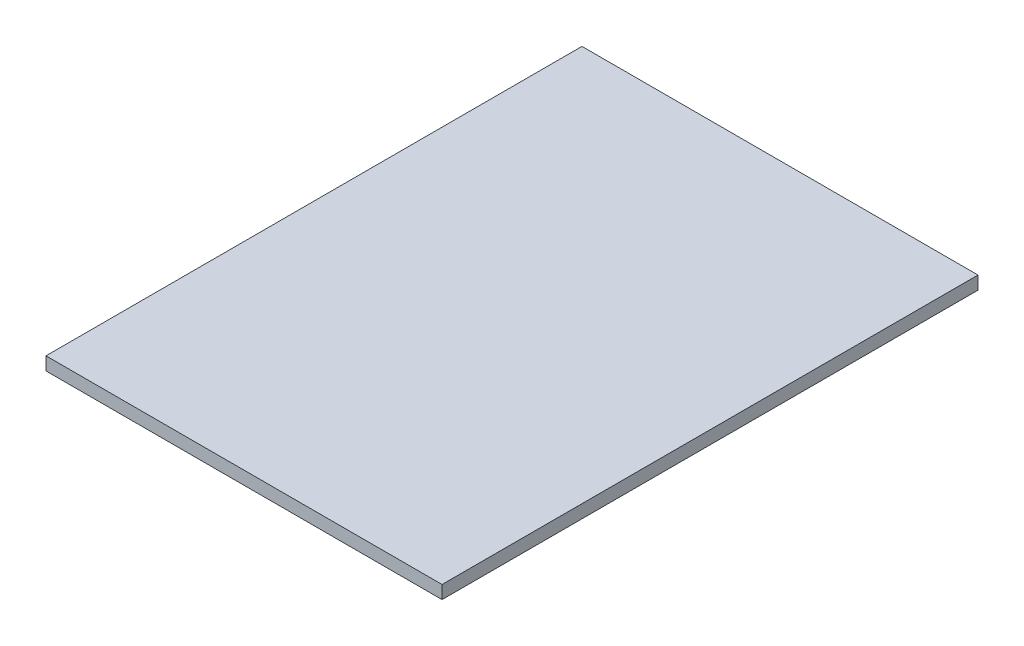
ISO-10303-21;
HEADER;
FILE_DESCRIPTION(('STEP AP214'),'2;1');
FILE_NAME('part.step','',(''),(''),'','','');
FILE_SCHEMA(('AUTOMOTIVE_DESIGN { 1 0 10303 214 1 1 1 1 }'));
ENDSEC;
DATA;
#1=APPLICATION_CONTEXT('core data for automotive mechanical design processes');
#2=APPLICATION_PROTOCOL_DEFINITION('international standard','automotive_design',2000,#1);
#3=PRODUCT_CONTEXT('',#1,'mechanical');
#4=PRODUCT('Part','Part','',(#3));
#5=PRODUCT_RELATED_PRODUCT_CATEGORY('part','',(#4));
#6=PRODUCT_DEFINITION_FORMATION('','',#4);
#7=PRODUCT_DEFINITION_CONTEXT('part definition',#1,'design');
#8=PRODUCT_DEFINITION('design','',#6,#7);
#9=PRODUCT_DEFINITION_SHAPE('','',#8);
#10=(LENGTH_UNIT() NAMED_UNIT(*) SI_UNIT(.MILLI.,.METRE.));
#11=(NAMED_UNIT(*) PLANE_ANGLE_UNIT() SI_UNIT($,.RADIAN.));
#12=(NAMED_UNIT(*) SI_UNIT($,.STERADIAN.) SOLID_ANGLE_UNIT());
#13=UNCERTAINTY_MEASURE_WITH_UNIT(LENGTH_MEASURE(1.E-05),#10,'distance_accuracy_value','');
#14=(GEOMETRIC_REPRESENTATION_CONTEXT(3) GLOBAL_UNCERTAINTY_ASSIGNED_CONTEXT((#13)) GLOBAL_UNIT_ASSIGNED_CONTEXT((#10,
#11,#12)) REPRESENTATION_CONTEXT('',''));
#15=CARTESIAN_POINT('',(0.,0.,0.));
#16=DIRECTION('',(0.,0.,1.));
#17=DIRECTION('',(1.,0.,0.));
#18=AXIS2_PLACEMENT_3D('',#15,#16,#17);
#19=CARTESIAN_POINT('',(64.1919634007864,5.,106.233178867499));
#20=DIRECTION('',(-1.,0.,0.));
#21=DIRECTION('',(0.,0.,1.));
#22=AXIS2_PLACEMENT_3D('',#19,#20,#21);
#23=PLANE('',#22);
#24=DIRECTION('',(0.,0.,-1.));
#25=VECTOR('',#24,1.);
#26=CARTESIAN_POINT('',(64.1919634007864,0.,106.233178867499));
#27=LINE('',#26,#25);
#28=CARTESIAN_POINT('',(64.1919634007864,0.,106.233178867499));
#29=VERTEX_POINT('',#28);
#30=CARTESIAN_POINT('',(64.1919634007864,0.,-98.0961694223284));
#31=VERTEX_POINT('',#30);
#32=EDGE_CURVE('E99',#29,#31,#27,.T.);
#33=ORIENTED_EDGE('',*,*,#32,.T.);
#34=DIRECTION('',(0.,-1.,0.));
#35=VECTOR('',#34,1.);
#36=CARTESIAN_POINT('',(64.1919634007864,5.,-98.0961694223284));
#37=LINE('',#36,#35);
#38=CARTESIAN_POINT('',(64.1919634007864,5.,-98.0961694223284));
#39=VERTEX_POINT('',#38);
#40=EDGE_CURVE('E11',#39,#31,#37,.T.);
#41=ORIENTED_EDGE('',*,*,#40,.F.);
#42=DIRECTION('',(0.,0.,-1.));
#43=VECTOR('',#42,1.);
#44=CARTESIAN_POINT('',(64.1919634007864,5.,106.233178867499));
#45=LINE('',#44,#43);
#46=CARTESIAN_POINT('',(64.1919634007864,5.,106.233178867499));
#47=VERTEX_POINT('',#46);
#48=EDGE_CURVE('E87',#47,#39,#45,.T.);
#49=ORIENTED_EDGE('',*,*,#48,.F.);
#50=DIRECTION('',(0.,-1.,0.));
#51=VECTOR('',#50,1.);
#52=CARTESIAN_POINT('',(64.1919634007864,5.,106.233178867499));
#53=LINE('',#52,#51);
#54=EDGE_CURVE('E95',#47,#29,#53,.T.);
#55=ORIENTED_EDGE('',*,*,#54,.T.);
#56=EDGE_LOOP('',(#33,#41,#49,#55));
#57=FACE_BOUND('',#56,.T.);
#58=ADVANCED_FACE('F36',(#57),#23,.F.);
#59=CARTESIAN_POINT('',(-86.7947674151477,5.,-98.0961694223284));
#60=DIRECTION('',(0.,0.,1.));
#61=DIRECTION('',(1.,0.,0.));
#62=AXIS2_PLACEMENT_3D('',#59,#60,#61);
#63=PLANE('',#62);
#64=DIRECTION('',(-1.,0.,0.));
#65=VECTOR('',#64,1.);
#66=CARTESIAN_POINT('',(-86.7947674151477,0.,-98.0961694223284));
#67=LINE('',#66,#65);
#68=CARTESIAN_POINT('',(-86.7947674151477,0.,-98.0961694223284));
#69=VERTEX_POINT('',#68);
#70=EDGE_CURVE('E91',#31,#69,#67,.T.);
#71=ORIENTED_EDGE('',*,*,#70,.T.);
#72=DIRECTION('',(0.,-1.,0.));
#73=VECTOR('',#72,1.);
#74=CARTESIAN_POINT('',(-86.7947674151477,5.,-98.0961694223284));
#75=LINE('',#74,#73);
#76=CARTESIAN_POINT('',(-86.7947674151477,5.,-98.0961694223284));
#77=VERTEX_POINT('',#76);
#78=EDGE_CURVE('E44',#77,#69,#75,.T.);
#79=ORIENTED_EDGE('',*,*,#78,.F.);
#80=DIRECTION('',(-1.,0.,0.));
#81=VECTOR('',#80,1.);
#82=CARTESIAN_POINT('',(-86.7947674151477,5.,-98.0961694223284));
#83=LINE('',#82,#81);
#84=EDGE_CURVE('E82',#39,#77,#83,.T.);
#85=ORIENTED_EDGE('',*,*,#84,.F.);
#86=ORIENTED_EDGE('',*,*,#40,.T.);
#87=EDGE_LOOP('',(#71,#79,#85,#86));
#88=FACE_BOUND('',#87,.T.);
#89=ADVANCED_FACE('F90',(#88),#63,.F.);
#90=CARTESIAN_POINT('',(-86.7947674151477,5.,106.233178867499));
#91=DIRECTION('',(1.,0.,0.));
#92=DIRECTION('',(0.,0.,-1.));
#93=AXIS2_PLACEMENT_3D('',#90,#91,#92);
#94=PLANE('',#93);
#95=DIRECTION('',(0.,0.,1.));
#96=VECTOR('',#95,1.);
#97=CARTESIAN_POINT('',(-86.7947674151477,0.,106.233178867499));
#98=LINE('',#97,#96);
#99=CARTESIAN_POINT('',(-86.7947674151477,0.,106.233178867499));
#100=VERTEX_POINT('',#99);
#101=EDGE_CURVE('E69',#69,#100,#98,.T.);
#102=ORIENTED_EDGE('',*,*,#101,.T.);
#103=DIRECTION('',(0.,-1.,0.));
#104=VECTOR('',#103,1.);
#105=CARTESIAN_POINT('',(-86.7947674151477,5.,106.233178867499));
#106=LINE('',#105,#104);
#107=CARTESIAN_POINT('',(-86.7947674151477,5.,106.233178867499));
#108=VERTEX_POINT('',#107);
#109=EDGE_CURVE('E92',#108,#100,#106,.T.);
#110=ORIENTED_EDGE('',*,*,#109,.F.);
#111=DIRECTION('',(0.,0.,1.));
#112=VECTOR('',#111,1.);
#113=CARTESIAN_POINT('',(-86.7947674151477,5.,106.233178867499));
#114=LINE('',#113,#112);
#115=EDGE_CURVE('E85',#77,#108,#114,.T.);
#116=ORIENTED_EDGE('',*,*,#115,.F.);
#117=ORIENTED_EDGE('',*,*,#78,.T.);
#118=EDGE_LOOP('',(#102,#110,#116,#117));
#119=FACE_BOUND('',#118,.T.);
#120=ADVANCED_FACE('F93',(#119),#94,.F.);
#121=CARTESIAN_POINT('',(-86.7947674151477,5.,106.233178867499));
#122=DIRECTION('',(0.,0.,-1.));
#123=DIRECTION('',(-1.,0.,0.));
#124=AXIS2_PLACEMENT_3D('',#121,#122,#123);
#125=PLANE('',#124);
#126=DIRECTION('',(1.,0.,0.));
#127=VECTOR('',#126,1.);
#128=CARTESIAN_POINT('',(-86.7947674151477,0.,106.233178867499));
#129=LINE('',#128,#127);
#130=EDGE_CURVE('E75',#100,#29,#129,.T.);
#131=ORIENTED_EDGE('',*,*,#130,.T.);
#132=ORIENTED_EDGE('',*,*,#54,.F.);
#133=DIRECTION('',(1.,0.,0.));
#134=VECTOR('',#133,1.);
#135=CARTESIAN_POINT('',(-86.7947674151477,5.,106.233178867499));
#136=LINE('',#135,#134);
#137=EDGE_CURVE('E52',#108,#47,#136,.T.);
#138=ORIENTED_EDGE('',*,*,#137,.F.);
#139=ORIENTED_EDGE('',*,*,#109,.T.);
#140=EDGE_LOOP('',(#131,#132,#138,#139));
#141=FACE_BOUND('',#140,.T.);
#142=ADVANCED_FACE('F106',(#141),#125,.F.);
#143=CARTESIAN_POINT('',(0.,5.,0.));
#144=DIRECTION('',(0.,-1.,0.));
#145=DIRECTION('',(0.,0.,-1.));
#146=AXIS2_PLACEMENT_3D('',#143,#144,#145);
#147=PLANE('',#146);
#148=ORIENTED_EDGE('',*,*,#48,.T.);
#149=ORIENTED_EDGE('',*,*,#84,.T.);
#150=ORIENTED_EDGE('',*,*,#115,.T.);
#151=ORIENTED_EDGE('',*,*,#137,.T.);
#152=EDGE_LOOP('',(#148,#149,#150,#151));
#153=FACE_BOUND('',#152,.T.);
#154=ADVANCED_FACE('F83',(#153),#147,.F.);
#155=CARTESIAN_POINT('',(0.,0.,0.));
#156=DIRECTION('',(0.,-1.,0.));
#157=DIRECTION('',(0.,0.,-1.));
#158=AXIS2_PLACEMENT_3D('',#155,#156,#157);
#159=PLANE('',#158);
#160=ORIENTED_EDGE('',*,*,#32,.F.);
#161=ORIENTED_EDGE('',*,*,#130,.F.);
#162=ORIENTED_EDGE('',*,*,#101,.F.);
#163=ORIENTED_EDGE('',*,*,#70,.F.);
#164=EDGE_LOOP('',(#160,#161,#162,#163));
#165=FACE_BOUND('',#164,.T.);
#166=ADVANCED_FACE('F109',(#165),#159,.T.);
#167=CLOSED_SHELL('',(#58,#89,#120,#142,#154,#166));
#168=MANIFOLD_SOLID_BREP('B2',#167);
#169=ADVANCED_BREP_SHAPE_REPRESENTATION('',(#18,#168),#14);
#170=SHAPE_DEFINITION_REPRESENTATION(#9,#169);
ENDSEC;
END-ISO-10303-21;
